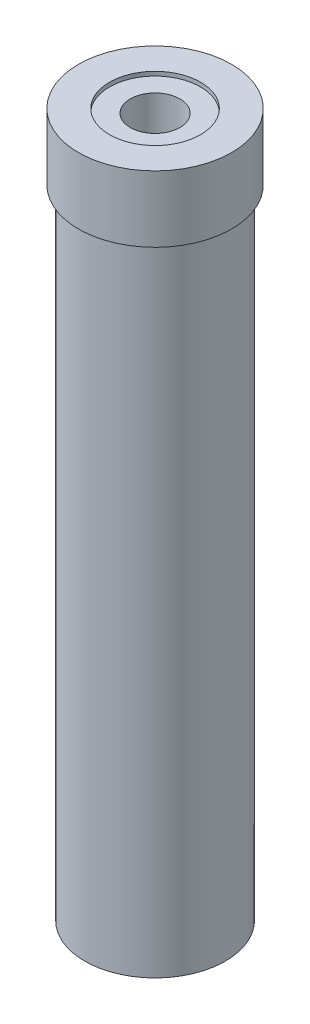
ISO-10303-21;
HEADER;
FILE_DESCRIPTION(('STEP AP214'),'2;1');
FILE_NAME('part.step','',(''),(''),'','','');
FILE_SCHEMA(('AUTOMOTIVE_DESIGN { 1 0 10303 214 1 1 1 1 }'));
ENDSEC;
DATA;
#1=APPLICATION_CONTEXT('core data for automotive mechanical design processes');
#2=APPLICATION_PROTOCOL_DEFINITION('international standard','automotive_design',2000,#1);
#3=PRODUCT_CONTEXT('',#1,'mechanical');
#4=PRODUCT('Part','Part','',(#3));
#5=PRODUCT_RELATED_PRODUCT_CATEGORY('part','',(#4));
#6=PRODUCT_DEFINITION_FORMATION('','',#4);
#7=PRODUCT_DEFINITION_CONTEXT('part definition',#1,'design');
#8=PRODUCT_DEFINITION('design','',#6,#7);
#9=PRODUCT_DEFINITION_SHAPE('','',#8);
#10=(LENGTH_UNIT() NAMED_UNIT(*) SI_UNIT(.MILLI.,.METRE.));
#11=(NAMED_UNIT(*) PLANE_ANGLE_UNIT() SI_UNIT($,.RADIAN.));
#12=(NAMED_UNIT(*) SI_UNIT($,.STERADIAN.) SOLID_ANGLE_UNIT());
#13=UNCERTAINTY_MEASURE_WITH_UNIT(LENGTH_MEASURE(1.E-05),#10,'distance_accuracy_value','');
#14=(GEOMETRIC_REPRESENTATION_CONTEXT(3) GLOBAL_UNCERTAINTY_ASSIGNED_CONTEXT((#13)) GLOBAL_UNIT_ASSIGNED_CONTEXT((#10,
#11,#12)) REPRESENTATION_CONTEXT('',''));
#15=CARTESIAN_POINT('',(0.,0.,0.));
#16=DIRECTION('',(0.,0.,1.));
#17=DIRECTION('',(1.,0.,0.));
#18=AXIS2_PLACEMENT_3D('',#15,#16,#17);
#19=CARTESIAN_POINT('',(0.,19.,0.));
#20=DIRECTION('',(0.,1.,0.));
#21=DIRECTION('',(0.,0.,1.));
#22=AXIS2_PLACEMENT_3D('',#19,#20,#21);
#23=PLANE('',#22);
#24=CARTESIAN_POINT('',(0.,19.,0.));
#25=DIRECTION('',(0.,1.,0.));
#26=DIRECTION('',(0.,0.,1.));
#27=AXIS2_PLACEMENT_3D('',#24,#25,#26);
#28=CIRCLE('',#27,6.);
#29=CARTESIAN_POINT('',(0.,19.,6.));
#30=VERTEX_POINT('',#29);
#31=EDGE_CURVE('E18',#30,#30,#28,.T.);
#32=ORIENTED_EDGE('',*,*,#31,.T.);
#33=EDGE_LOOP('',(#32));
#34=FACE_BOUND('',#33,.T.);
#35=ADVANCED_FACE('F15',(#34),#23,.T.);
#36=CARTESIAN_POINT('',(0.,19.,0.));
#37=DIRECTION('',(0.,1.,0.));
#38=DIRECTION('',(0.,0.,1.));
#39=AXIS2_PLACEMENT_3D('',#36,#37,#38);
#40=CYLINDRICAL_SURFACE('',#39,6.);
#41=CARTESIAN_POINT('',(0.,169.,0.));
#42=DIRECTION('',(0.,1.,0.));
#43=DIRECTION('',(0.,0.,1.));
#44=AXIS2_PLACEMENT_3D('',#41,#42,#43);
#45=CIRCLE('',#44,6.);
#46=CARTESIAN_POINT('',(0.,169.,6.));
#47=VERTEX_POINT('',#46);
#48=EDGE_CURVE('E40',#47,#47,#45,.F.);
#49=ORIENTED_EDGE('',*,*,#48,.F.);
#50=EDGE_LOOP('',(#49));
#51=FACE_BOUND('',#50,.T.);
#52=ORIENTED_EDGE('',*,*,#31,.F.);
#53=EDGE_LOOP('',(#52));
#54=FACE_BOUND('',#53,.T.);
#55=ADVANCED_FACE('F48',(#51,#54),#40,.F.);
#56=CARTESIAN_POINT('',(0.,169.,0.));
#57=DIRECTION('',(0.,1.,0.));
#58=DIRECTION('',(0.,0.,1.));
#59=AXIS2_PLACEMENT_3D('',#56,#57,#58);
#60=PLANE('',#59);
#61=ORIENTED_EDGE('',*,*,#48,.T.);
#62=EDGE_LOOP('',(#61));
#63=FACE_BOUND('',#62,.T.);
#64=CARTESIAN_POINT('',(0.,169.,0.));
#65=DIRECTION('',(0.,1.,0.));
#66=DIRECTION('',(0.,0.,1.));
#67=AXIS2_PLACEMENT_3D('',#64,#65,#66);
#68=CIRCLE('',#67,11.);
#69=CARTESIAN_POINT('',(0.,169.,11.));
#70=VERTEX_POINT('',#69);
#71=EDGE_CURVE('E38',#70,#70,#68,.T.);
#72=ORIENTED_EDGE('',*,*,#71,.T.);
#73=EDGE_LOOP('',(#72));
#74=FACE_BOUND('',#73,.T.);
#75=ADVANCED_FACE('F50',(#63,#74),#60,.T.);
#76=CARTESIAN_POINT('',(0.,169.,0.));
#77=DIRECTION('',(0.,1.,0.));
#78=DIRECTION('',(0.,0.,1.));
#79=AXIS2_PLACEMENT_3D('',#76,#77,#78);
#80=CYLINDRICAL_SURFACE('',#79,11.);
#81=CARTESIAN_POINT('',(0.,170.,0.));
#82=DIRECTION('',(0.,1.,0.));
#83=DIRECTION('',(0.,0.,1.));
#84=AXIS2_PLACEMENT_3D('',#81,#82,#83);
#85=CIRCLE('',#84,11.);
#86=CARTESIAN_POINT('',(0.,170.,11.));
#87=VERTEX_POINT('',#86);
#88=EDGE_CURVE('E35',#87,#87,#85,.F.);
#89=ORIENTED_EDGE('',*,*,#88,.F.);
#90=EDGE_LOOP('',(#89));
#91=FACE_BOUND('',#90,.T.);
#92=ORIENTED_EDGE('',*,*,#71,.F.);
#93=EDGE_LOOP('',(#92));
#94=FACE_BOUND('',#93,.T.);
#95=ADVANCED_FACE('F57',(#91,#94),#80,.F.);
#96=CARTESIAN_POINT('',(0.,170.,0.));
#97=DIRECTION('',(0.,1.,0.));
#98=DIRECTION('',(0.,0.,1.));
#99=AXIS2_PLACEMENT_3D('',#96,#97,#98);
#100=PLANE('',#99);
#101=ORIENTED_EDGE('',*,*,#88,.T.);
#102=EDGE_LOOP('',(#101));
#103=FACE_BOUND('',#102,.T.);
#104=CARTESIAN_POINT('',(0.,170.,0.));
#105=DIRECTION('',(0.,-1.,0.));
#106=DIRECTION('',(0.,0.,-1.));
#107=AXIS2_PLACEMENT_3D('',#104,#105,#106);
#108=CIRCLE('',#107,18.5);
#109=CARTESIAN_POINT('',(0.,170.,-18.5));
#110=VERTEX_POINT('',#109);
#111=EDGE_CURVE('E32',#110,#110,#108,.T.);
#112=ORIENTED_EDGE('',*,*,#111,.F.);
#113=EDGE_LOOP('',(#112));
#114=FACE_BOUND('',#113,.T.);
#115=ADVANCED_FACE('F77',(#103,#114),#100,.T.);
#116=CARTESIAN_POINT('',(0.,170.,0.));
#117=DIRECTION('',(0.,-1.,0.));
#118=DIRECTION('',(0.,0.,-1.));
#119=AXIS2_PLACEMENT_3D('',#116,#117,#118);
#120=CYLINDRICAL_SURFACE('',#119,18.5);
#121=CARTESIAN_POINT('',(0.,154.,0.));
#122=DIRECTION('',(0.,-1.,0.));
#123=DIRECTION('',(0.,0.,-1.));
#124=AXIS2_PLACEMENT_3D('',#121,#122,#123);
#125=CIRCLE('',#124,18.5);
#126=CARTESIAN_POINT('',(0.,154.,-18.5));
#127=VERTEX_POINT('',#126);
#128=EDGE_CURVE('E27',#127,#127,#125,.T.);
#129=ORIENTED_EDGE('',*,*,#128,.F.);
#130=EDGE_LOOP('',(#129));
#131=FACE_BOUND('',#130,.T.);
#132=ORIENTED_EDGE('',*,*,#111,.T.);
#133=EDGE_LOOP('',(#132));
#134=FACE_BOUND('',#133,.T.);
#135=ADVANCED_FACE('F73',(#131,#134),#120,.T.);
#136=CARTESIAN_POINT('',(0.,154.,0.));
#137=DIRECTION('',(0.,-1.,0.));
#138=DIRECTION('',(0.,0.,-1.));
#139=AXIS2_PLACEMENT_3D('',#136,#137,#138);
#140=PLANE('',#139);
#141=CARTESIAN_POINT('',(0.,154.,0.));
#142=DIRECTION('',(0.,-1.,0.));
#143=DIRECTION('',(0.,0.,-1.));
#144=AXIS2_PLACEMENT_3D('',#141,#142,#143);
#145=CIRCLE('',#144,17.);
#146=CARTESIAN_POINT('',(0.,154.,-17.));
#147=VERTEX_POINT('',#146);
#148=EDGE_CURVE('E22',#147,#147,#145,.T.);
#149=ORIENTED_EDGE('',*,*,#148,.F.);
#150=EDGE_LOOP('',(#149));
#151=FACE_BOUND('',#150,.T.);
#152=ORIENTED_EDGE('',*,*,#128,.T.);
#153=EDGE_LOOP('',(#152));
#154=FACE_BOUND('',#153,.T.);
#155=ADVANCED_FACE('F66',(#151,#154),#140,.T.);
#156=CARTESIAN_POINT('',(0.,0.,0.));
#157=DIRECTION('',(0.,1.,0.));
#158=DIRECTION('',(0.,0.,1.));
#159=AXIS2_PLACEMENT_3D('',#156,#157,#158);
#160=PLANE('',#159);
#161=CARTESIAN_POINT('',(0.,0.,0.));
#162=DIRECTION('',(0.,-1.,0.));
#163=DIRECTION('',(0.,0.,-1.));
#164=AXIS2_PLACEMENT_3D('',#161,#162,#163);
#165=CIRCLE('',#164,17.);
#166=CARTESIAN_POINT('',(0.,0.,-17.));
#167=VERTEX_POINT('',#166);
#168=EDGE_CURVE('E10',#167,#167,#165,.F.);
#169=ORIENTED_EDGE('',*,*,#168,.F.);
#170=EDGE_LOOP('',(#169));
#171=FACE_BOUND('',#170,.T.);
#172=ADVANCED_FACE('F61',(#171),#160,.F.);
#173=CARTESIAN_POINT('',(0.,154.,0.));
#174=DIRECTION('',(0.,-1.,0.));
#175=DIRECTION('',(0.,0.,-1.));
#176=AXIS2_PLACEMENT_3D('',#173,#174,#175);
#177=CYLINDRICAL_SURFACE('',#176,17.);
#178=ORIENTED_EDGE('',*,*,#168,.T.);
#179=EDGE_LOOP('',(#178));
#180=FACE_BOUND('',#179,.T.);
#181=ORIENTED_EDGE('',*,*,#148,.T.);
#182=EDGE_LOOP('',(#181));
#183=FACE_BOUND('',#182,.T.);
#184=ADVANCED_FACE('F59',(#180,#183),#177,.T.);
#185=CLOSED_SHELL('',(#35,#55,#75,#95,#115,#135,#155,#172,#184));
#186=MANIFOLD_SOLID_BREP('B1',#185);
#187=ADVANCED_BREP_SHAPE_REPRESENTATION('',(#18,#186),#14);
#188=SHAPE_DEFINITION_REPRESENTATION(#9,#187);
ENDSEC;
END-ISO-10303-21;
